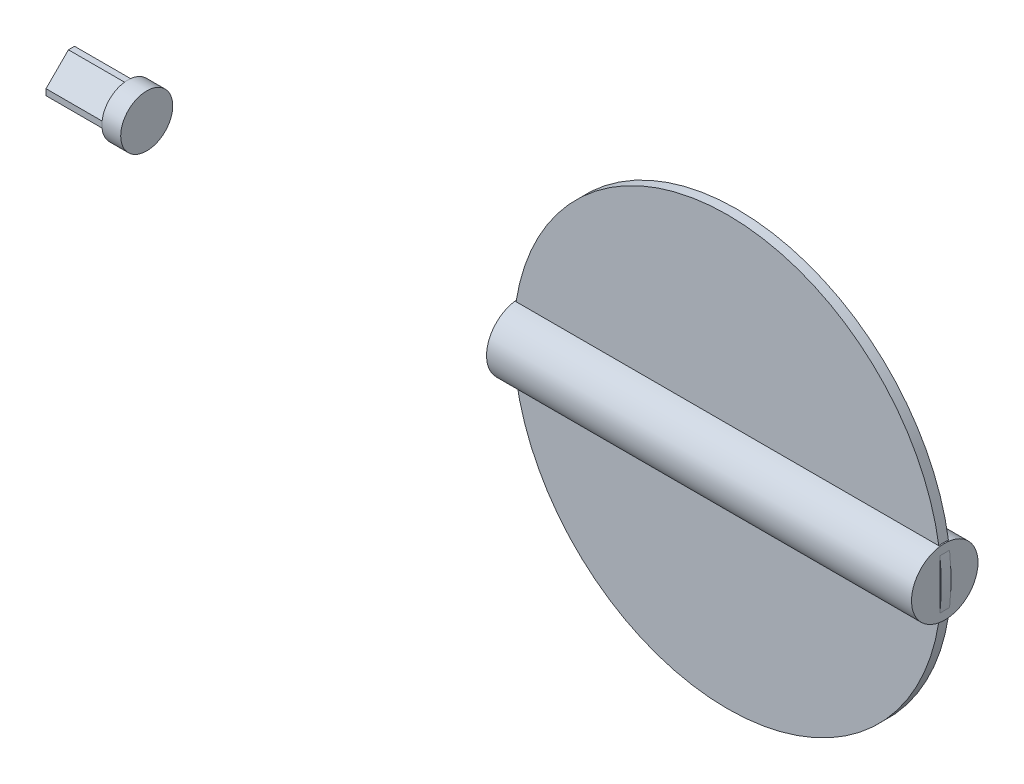
ISO-10303-21;
HEADER;
FILE_DESCRIPTION(('STEP AP214'),'2;1');
FILE_NAME('part.step','',(''),(''),'','','');
FILE_SCHEMA(('AUTOMOTIVE_DESIGN { 1 0 10303 214 1 1 1 1 }'));
ENDSEC;
DATA;
#1=APPLICATION_CONTEXT('core data for automotive mechanical design processes');
#2=APPLICATION_PROTOCOL_DEFINITION('international standard','automotive_design',2000,#1);
#3=PRODUCT_CONTEXT('',#1,'mechanical');
#4=PRODUCT('Part','Part','',(#3));
#5=PRODUCT_RELATED_PRODUCT_CATEGORY('part','',(#4));
#6=PRODUCT_DEFINITION_FORMATION('','',#4);
#7=PRODUCT_DEFINITION_CONTEXT('part definition',#1,'design');
#8=PRODUCT_DEFINITION('design','',#6,#7);
#9=PRODUCT_DEFINITION_SHAPE('','',#8);
#10=(LENGTH_UNIT() NAMED_UNIT(*) SI_UNIT(.MILLI.,.METRE.));
#11=(NAMED_UNIT(*) PLANE_ANGLE_UNIT() SI_UNIT($,.RADIAN.));
#12=(NAMED_UNIT(*) SI_UNIT($,.STERADIAN.) SOLID_ANGLE_UNIT());
#13=UNCERTAINTY_MEASURE_WITH_UNIT(LENGTH_MEASURE(1.E-05),#10,'distance_accuracy_value','');
#14=(GEOMETRIC_REPRESENTATION_CONTEXT(3) GLOBAL_UNCERTAINTY_ASSIGNED_CONTEXT((#13)) GLOBAL_UNIT_ASSIGNED_CONTEXT((#10,
#11,#12)) REPRESENTATION_CONTEXT('',''));
#15=CARTESIAN_POINT('',(0.,0.,0.));
#16=DIRECTION('',(0.,0.,1.));
#17=DIRECTION('',(1.,0.,0.));
#18=AXIS2_PLACEMENT_3D('',#15,#16,#17);
#19=CARTESIAN_POINT('',(-202.5519,0.,0.));
#20=DIRECTION('',(-1.,0.,0.));
#21=DIRECTION('',(0.,0.,1.));
#22=AXIS2_PLACEMENT_3D('',#19,#20,#21);
#23=CYLINDRICAL_SURFACE('',#22,9.);
#24=CARTESIAN_POINT('',(-202.5519,0.,0.));
#25=DIRECTION('',(1.,0.,0.));
#26=DIRECTION('',(0.,0.,-1.));
#27=AXIS2_PLACEMENT_3D('',#24,#25,#26);
#28=CIRCLE('',#27,9.);
#29=CARTESIAN_POINT('',(-202.5519,0.,9.));
#30=VERTEX_POINT('',#29);
#31=EDGE_CURVE('E12',#30,#30,#28,.T.);
#32=CARTESIAN_POINT('',(-209.0719,0.,0.));
#33=DIRECTION('',(1.,0.,0.));
#34=DIRECTION('',(0.,0.,-1.));
#35=AXIS2_PLACEMENT_3D('',#32,#33,#34);
#36=CIRCLE('',#35,9.);
#37=CARTESIAN_POINT('',(-209.0719,0.,9.));
#38=VERTEX_POINT('',#37);
#39=EDGE_CURVE('E53',#38,#38,#36,.T.);
#40=CARTESIAN_POINT('',(-202.5519,0.,9.));
#41=CARTESIAN_POINT('',(-202.619816666667,0.,9.));
#42=CARTESIAN_POINT('',(-202.687733333333,0.,9.));
#43=CARTESIAN_POINT('',(-202.823566666667,0.,9.));
#44=CARTESIAN_POINT('',(-202.891483333333,0.,9.));
#45=CARTESIAN_POINT('',(-203.027316666667,0.,9.));
#46=CARTESIAN_POINT('',(-203.095233333333,0.,9.));
#47=CARTESIAN_POINT('',(-203.231066666667,0.,9.));
#48=CARTESIAN_POINT('',(-203.298983333333,0.,9.));
#49=CARTESIAN_POINT('',(-203.434816666667,0.,9.));
#50=CARTESIAN_POINT('',(-203.502733333333,0.,9.));
#51=CARTESIAN_POINT('',(-203.638566666667,0.,9.));
#52=CARTESIAN_POINT('',(-203.706483333333,0.,9.));
#53=CARTESIAN_POINT('',(-203.842316666667,0.,9.));
#54=CARTESIAN_POINT('',(-203.910233333333,0.,9.));
#55=CARTESIAN_POINT('',(-204.046066666667,0.,9.));
#56=CARTESIAN_POINT('',(-204.113983333333,0.,9.));
#57=CARTESIAN_POINT('',(-204.249816666667,0.,9.));
#58=CARTESIAN_POINT('',(-204.317733333333,0.,9.));
#59=CARTESIAN_POINT('',(-204.453566666667,0.,9.));
#60=CARTESIAN_POINT('',(-204.521483333333,0.,9.));
#61=CARTESIAN_POINT('',(-204.657316666667,0.,9.));
#62=CARTESIAN_POINT('',(-204.725233333333,0.,9.));
#63=CARTESIAN_POINT('',(-204.861066666667,0.,9.));
#64=CARTESIAN_POINT('',(-204.928983333333,0.,9.));
#65=CARTESIAN_POINT('',(-205.064816666667,0.,9.));
#66=CARTESIAN_POINT('',(-205.132733333333,0.,9.));
#67=CARTESIAN_POINT('',(-205.268566666667,0.,9.));
#68=CARTESIAN_POINT('',(-205.336483333333,0.,9.));
#69=CARTESIAN_POINT('',(-205.472316666667,0.,9.));
#70=CARTESIAN_POINT('',(-205.540233333333,0.,9.));
#71=CARTESIAN_POINT('',(-205.676066666667,0.,9.));
#72=CARTESIAN_POINT('',(-205.743983333333,0.,9.));
#73=CARTESIAN_POINT('',(-205.879816666667,0.,9.));
#74=CARTESIAN_POINT('',(-205.947733333333,0.,9.));
#75=CARTESIAN_POINT('',(-206.083566666667,0.,9.));
#76=CARTESIAN_POINT('',(-206.151483333333,0.,9.));
#77=CARTESIAN_POINT('',(-206.287316666667,0.,9.));
#78=CARTESIAN_POINT('',(-206.355233333333,0.,9.));
#79=CARTESIAN_POINT('',(-206.491066666667,0.,9.));
#80=CARTESIAN_POINT('',(-206.558983333333,0.,9.));
#81=CARTESIAN_POINT('',(-206.694816666667,0.,9.));
#82=CARTESIAN_POINT('',(-206.762733333333,0.,9.));
#83=CARTESIAN_POINT('',(-206.898566666667,0.,9.));
#84=CARTESIAN_POINT('',(-206.966483333333,0.,9.));
#85=CARTESIAN_POINT('',(-207.102316666667,0.,9.));
#86=CARTESIAN_POINT('',(-207.170233333333,0.,9.));
#87=CARTESIAN_POINT('',(-207.306066666667,0.,9.));
#88=CARTESIAN_POINT('',(-207.373983333333,0.,9.));
#89=CARTESIAN_POINT('',(-207.509816666667,0.,9.));
#90=CARTESIAN_POINT('',(-207.577733333333,0.,9.));
#91=CARTESIAN_POINT('',(-207.713566666667,0.,9.));
#92=CARTESIAN_POINT('',(-207.781483333333,0.,9.));
#93=CARTESIAN_POINT('',(-207.917316666667,0.,9.));
#94=CARTESIAN_POINT('',(-207.985233333333,0.,9.));
#95=CARTESIAN_POINT('',(-208.121066666667,0.,9.));
#96=CARTESIAN_POINT('',(-208.188983333333,0.,9.));
#97=CARTESIAN_POINT('',(-208.324816666667,0.,9.));
#98=CARTESIAN_POINT('',(-208.392733333333,0.,9.));
#99=CARTESIAN_POINT('',(-208.528566666667,0.,9.));
#100=CARTESIAN_POINT('',(-208.596483333333,0.,9.));
#101=CARTESIAN_POINT('',(-208.732316666667,0.,9.));
#102=CARTESIAN_POINT('',(-208.800233333333,0.,9.));
#103=CARTESIAN_POINT('',(-208.936066666667,0.,9.));
#104=CARTESIAN_POINT('',(-209.003983333333,0.,9.));
#105=CARTESIAN_POINT('',(-209.0719,0.,9.));
#106=B_SPLINE_CURVE_WITH_KNOTS('',3,(#40,#41,#42,#43,#44,#45,#46,#47,#48,#49,#50,#51,#52,#53,
#54,#55,#56,#57,#58,#59,#60,#61,#62,#63,#64,#65,#66,#67,#68,#69,#70,#71,#72,#73,#74,#75,#76,#77,
#78,#79,#80,#81,#82,#83,#84,#85,#86,#87,#88,#89,#90,#91,#92,#93,#94,#95,#96,#97,#98,#99,#100,
#101,#102,#103,#104,#105),.UNSPECIFIED.,.F.,.F.,(4,2,2,2,2,2,2,2,2,2,2,2,2,2,2,2,2,2,2,2,2,2,2,
2,2,2,2,2,2,2,2,2,4),(0.,0.203750000000003,0.407500000000005,0.611250000000008,0.81500000000001,
1.01875000000001,1.22250000000002,1.42625000000002,1.63000000000002,1.83375000000002,
2.03750000000003,2.24125,2.445,2.64875000000001,2.85250000000001,3.05625000000001,
3.26000000000001,3.46375000000002,3.66750000000002,3.87125000000002,4.07500000000002,4.27875,
4.4825,4.68625,4.89000000000001,5.09375000000001,5.29750000000001,5.50125000000001,
5.70500000000002,5.90875000000002,6.11250000000002,6.31625000000002,6.52),.UNSPECIFIED.);
#107=EDGE_CURVE('BSEAM51',#30,#38,#106,.T.);
#108=ORIENTED_EDGE('',*,*,#31,.F.);
#109=ORIENTED_EDGE('',*,*,#39,.T.);
#110=ORIENTED_EDGE('',*,*,#107,.T.);
#111=ORIENTED_EDGE('',*,*,#107,.F.);
#112=EDGE_LOOP('',(#108,#110,#109,#111));
#113=FACE_BOUND('',#112,.T.);
#114=ADVANCED_FACE('F51',(#113),#23,.T.);
#115=CARTESIAN_POINT('',(-202.5519,0.,0.));
#116=DIRECTION('',(1.,0.,0.));
#117=DIRECTION('',(0.,0.,-1.));
#118=AXIS2_PLACEMENT_3D('',#115,#116,#117);
#119=PLANE('',#118);
#120=ORIENTED_EDGE('',*,*,#31,.T.);
#121=EDGE_LOOP('',(#120));
#122=FACE_BOUND('',#121,.T.);
#123=ADVANCED_FACE('F194',(#122),#119,.T.);
#124=CARTESIAN_POINT('',(-209.0719,0.,0.));
#125=DIRECTION('',(1.,0.,0.));
#126=DIRECTION('',(0.,0.,-1.));
#127=AXIS2_PLACEMENT_3D('',#124,#125,#126);
#128=PLANE('',#127);
#129=DIRECTION('',(0.,0.,1.));
#130=VECTOR('',#129,1.);
#131=CARTESIAN_POINT('',(-209.0719,8.82,-1.06));
#132=LINE('',#131,#130);
#133=CARTESIAN_POINT('',(-209.0719,8.82,-1.06));
#134=VERTEX_POINT('',#133);
#135=CARTESIAN_POINT('',(-209.0719,8.82,1.06));
#136=VERTEX_POINT('',#135);
#137=EDGE_CURVE('E157',#134,#136,#132,.T.);
#138=ORIENTED_EDGE('',*,*,#137,.T.);
#139=DIRECTION('',(0.,-0.707106781186547,0.707106781186547));
#140=VECTOR('',#139,1.);
#141=CARTESIAN_POINT('',(-209.0719,8.82,1.06));
#142=LINE('',#141,#140);
#143=CARTESIAN_POINT('',(-209.0719,1.06,8.82));
#144=VERTEX_POINT('',#143);
#145=EDGE_CURVE('E62',#136,#144,#142,.T.);
#146=ORIENTED_EDGE('',*,*,#145,.T.);
#147=DIRECTION('',(0.,-1.,0.));
#148=VECTOR('',#147,1.);
#149=CARTESIAN_POINT('',(-209.0719,1.06,8.82));
#150=LINE('',#149,#148);
#151=CARTESIAN_POINT('',(-209.0719,-1.06,8.82));
#152=VERTEX_POINT('',#151);
#153=EDGE_CURVE('E114',#144,#152,#150,.T.);
#154=ORIENTED_EDGE('',*,*,#153,.T.);
#155=DIRECTION('',(0.,-0.707106781186547,-0.707106781186547));
#156=VECTOR('',#155,1.);
#157=CARTESIAN_POINT('',(-209.0719,-1.06,8.82));
#158=LINE('',#157,#156);
#159=CARTESIAN_POINT('',(-209.0719,-8.82,1.06));
#160=VERTEX_POINT('',#159);
#161=EDGE_CURVE('E152',#152,#160,#158,.T.);
#162=ORIENTED_EDGE('',*,*,#161,.T.);
#163=DIRECTION('',(0.,0.,-1.));
#164=VECTOR('',#163,1.);
#165=CARTESIAN_POINT('',(-209.0719,-8.82,1.06));
#166=LINE('',#165,#164);
#167=CARTESIAN_POINT('',(-209.0719,-8.82,-1.06));
#168=VERTEX_POINT('',#167);
#169=EDGE_CURVE('E155',#160,#168,#166,.T.);
#170=ORIENTED_EDGE('',*,*,#169,.T.);
#171=DIRECTION('',(0.,0.707106781186547,-0.707106781186547));
#172=VECTOR('',#171,1.);
#173=CARTESIAN_POINT('',(-209.0719,-8.82,-1.06));
#174=LINE('',#173,#172);
#175=CARTESIAN_POINT('',(-209.0719,-1.06,-8.82));
#176=VERTEX_POINT('',#175);
#177=EDGE_CURVE('E128',#168,#176,#174,.T.);
#178=ORIENTED_EDGE('',*,*,#177,.T.);
#179=DIRECTION('',(0.,1.,0.));
#180=VECTOR('',#179,1.);
#181=CARTESIAN_POINT('',(-209.0719,-1.06,-8.82));
#182=LINE('',#181,#180);
#183=CARTESIAN_POINT('',(-209.0719,1.06,-8.82));
#184=VERTEX_POINT('',#183);
#185=EDGE_CURVE('E140',#176,#184,#182,.T.);
#186=ORIENTED_EDGE('',*,*,#185,.T.);
#187=DIRECTION('',(0.,0.707106781186547,0.707106781186547));
#188=VECTOR('',#187,1.);
#189=CARTESIAN_POINT('',(-209.0719,1.06,-8.82));
#190=LINE('',#189,#188);
#191=EDGE_CURVE('E144',#184,#134,#190,.T.);
#192=ORIENTED_EDGE('',*,*,#191,.T.);
#193=EDGE_LOOP('',(#138,#146,#154,#162,#170,#178,#186,#192));
#194=FACE_BOUND('',#193,.T.);
#195=ORIENTED_EDGE('',*,*,#39,.F.);
#196=EDGE_LOOP('',(#195));
#197=FACE_BOUND('',#196,.T.);
#198=ADVANCED_FACE('F146',(#194,#197),#128,.F.);
#199=CARTESIAN_POINT('',(-209.0719,8.82,1.06));
#200=DIRECTION('',(0.,-0.707106781186548,-0.707106781186548));
#201=DIRECTION('',(0.,0.707106781186548,-0.707106781186548));
#202=AXIS2_PLACEMENT_3D('',#199,#200,#201);
#203=PLANE('',#202);
#204=DIRECTION('',(0.,-0.707106781186547,0.707106781186547));
#205=VECTOR('',#204,1.);
#206=CARTESIAN_POINT('',(-228.5719,8.82,1.06));
#207=LINE('',#206,#205);
#208=CARTESIAN_POINT('',(-228.5719,8.82,1.06));
#209=VERTEX_POINT('',#208);
#210=CARTESIAN_POINT('',(-228.5719,1.06,8.82));
#211=VERTEX_POINT('',#210);
#212=EDGE_CURVE('E165',#209,#211,#207,.T.);
#213=ORIENTED_EDGE('',*,*,#212,.T.);
#214=DIRECTION('',(-1.,0.,0.));
#215=VECTOR('',#214,1.);
#216=CARTESIAN_POINT('',(-209.0719,1.06,8.82));
#217=LINE('',#216,#215);
#218=EDGE_CURVE('E186',#144,#211,#217,.T.);
#219=ORIENTED_EDGE('',*,*,#218,.F.);
#220=ORIENTED_EDGE('',*,*,#145,.F.);
#221=DIRECTION('',(-1.,0.,0.));
#222=VECTOR('',#221,1.);
#223=CARTESIAN_POINT('',(-209.0719,8.82,1.06));
#224=LINE('',#223,#222);
#225=EDGE_CURVE('E161',#136,#209,#224,.T.);
#226=ORIENTED_EDGE('',*,*,#225,.T.);
#227=EDGE_LOOP('',(#213,#219,#220,#226));
#228=FACE_BOUND('',#227,.T.);
#229=ADVANCED_FACE('F192',(#228),#203,.F.);
#230=CARTESIAN_POINT('',(-209.0719,1.06,8.82));
#231=DIRECTION('',(0.,0.,-1.));
#232=DIRECTION('',(-1.,0.,0.));
#233=AXIS2_PLACEMENT_3D('',#230,#231,#232);
#234=PLANE('',#233);
#235=DIRECTION('',(0.,-1.,0.));
#236=VECTOR('',#235,1.);
#237=CARTESIAN_POINT('',(-228.5719,1.06,8.82));
#238=LINE('',#237,#236);
#239=CARTESIAN_POINT('',(-228.5719,-1.06,8.82));
#240=VERTEX_POINT('',#239);
#241=EDGE_CURVE('E164',#211,#240,#238,.T.);
#242=ORIENTED_EDGE('',*,*,#241,.T.);
#243=DIRECTION('',(-1.,0.,0.));
#244=VECTOR('',#243,1.);
#245=CARTESIAN_POINT('',(-209.0719,-1.06,8.82));
#246=LINE('',#245,#244);
#247=EDGE_CURVE('E184',#152,#240,#246,.T.);
#248=ORIENTED_EDGE('',*,*,#247,.F.);
#249=ORIENTED_EDGE('',*,*,#153,.F.);
#250=ORIENTED_EDGE('',*,*,#218,.T.);
#251=EDGE_LOOP('',(#242,#248,#249,#250));
#252=FACE_BOUND('',#251,.T.);
#253=ADVANCED_FACE('F196',(#252),#234,.F.);
#254=CARTESIAN_POINT('',(-209.0719,-1.06,8.82));
#255=DIRECTION('',(0.,0.707106781186548,-0.707106781186548));
#256=DIRECTION('',(0.,0.707106781186548,0.707106781186548));
#257=AXIS2_PLACEMENT_3D('',#254,#255,#256);
#258=PLANE('',#257);
#259=DIRECTION('',(0.,-0.707106781186547,-0.707106781186547));
#260=VECTOR('',#259,1.);
#261=CARTESIAN_POINT('',(-228.5719,-1.06,8.82));
#262=LINE('',#261,#260);
#263=CARTESIAN_POINT('',(-228.5719,-8.82,1.06));
#264=VERTEX_POINT('',#263);
#265=EDGE_CURVE('E170',#240,#264,#262,.T.);
#266=ORIENTED_EDGE('',*,*,#265,.T.);
#267=DIRECTION('',(-1.,0.,0.));
#268=VECTOR('',#267,1.);
#269=CARTESIAN_POINT('',(-209.0719,-8.82,1.06));
#270=LINE('',#269,#268);
#271=EDGE_CURVE('E182',#160,#264,#270,.T.);
#272=ORIENTED_EDGE('',*,*,#271,.F.);
#273=ORIENTED_EDGE('',*,*,#161,.F.);
#274=ORIENTED_EDGE('',*,*,#247,.T.);
#275=EDGE_LOOP('',(#266,#272,#273,#274));
#276=FACE_BOUND('',#275,.T.);
#277=ADVANCED_FACE('F232',(#276),#258,.F.);
#278=CARTESIAN_POINT('',(-209.0719,-8.82,1.06));
#279=DIRECTION('',(0.,1.,0.));
#280=DIRECTION('',(0.,0.,1.));
#281=AXIS2_PLACEMENT_3D('',#278,#279,#280);
#282=PLANE('',#281);
#283=DIRECTION('',(0.,0.,-1.));
#284=VECTOR('',#283,1.);
#285=CARTESIAN_POINT('',(-228.5719,-8.82,1.06));
#286=LINE('',#285,#284);
#287=CARTESIAN_POINT('',(-228.5719,-8.82,-1.06));
#288=VERTEX_POINT('',#287);
#289=EDGE_CURVE('E166',#264,#288,#286,.T.);
#290=ORIENTED_EDGE('',*,*,#289,.T.);
#291=DIRECTION('',(-1.,0.,0.));
#292=VECTOR('',#291,1.);
#293=CARTESIAN_POINT('',(-209.0719,-8.82,-1.06));
#294=LINE('',#293,#292);
#295=EDGE_CURVE('E136',#168,#288,#294,.T.);
#296=ORIENTED_EDGE('',*,*,#295,.F.);
#297=ORIENTED_EDGE('',*,*,#169,.F.);
#298=ORIENTED_EDGE('',*,*,#271,.T.);
#299=EDGE_LOOP('',(#290,#296,#297,#298));
#300=FACE_BOUND('',#299,.T.);
#301=ADVANCED_FACE('F244',(#300),#282,.F.);
#302=CARTESIAN_POINT('',(-209.0719,-8.82,-1.06));
#303=DIRECTION('',(0.,0.707106781186548,0.707106781186548));
#304=DIRECTION('',(0.,-0.707106781186548,0.707106781186548));
#305=AXIS2_PLACEMENT_3D('',#302,#303,#304);
#306=PLANE('',#305);
#307=DIRECTION('',(0.,0.707106781186547,-0.707106781186547));
#308=VECTOR('',#307,1.);
#309=CARTESIAN_POINT('',(-228.5719,-8.82,-1.06));
#310=LINE('',#309,#308);
#311=CARTESIAN_POINT('',(-228.5719,-1.06,-8.82));
#312=VERTEX_POINT('',#311);
#313=EDGE_CURVE('E135',#288,#312,#310,.T.);
#314=ORIENTED_EDGE('',*,*,#313,.T.);
#315=DIRECTION('',(-1.,0.,0.));
#316=VECTOR('',#315,1.);
#317=CARTESIAN_POINT('',(-209.0719,-1.06,-8.82));
#318=LINE('',#317,#316);
#319=EDGE_CURVE('E125',#176,#312,#318,.T.);
#320=ORIENTED_EDGE('',*,*,#319,.F.);
#321=ORIENTED_EDGE('',*,*,#177,.F.);
#322=ORIENTED_EDGE('',*,*,#295,.T.);
#323=EDGE_LOOP('',(#314,#320,#321,#322));
#324=FACE_BOUND('',#323,.T.);
#325=ADVANCED_FACE('F130',(#324),#306,.F.);
#326=CARTESIAN_POINT('',(-209.0719,-1.06,-8.82));
#327=DIRECTION('',(0.,0.,1.));
#328=DIRECTION('',(1.,0.,0.));
#329=AXIS2_PLACEMENT_3D('',#326,#327,#328);
#330=PLANE('',#329);
#331=DIRECTION('',(0.,1.,0.));
#332=VECTOR('',#331,1.);
#333=CARTESIAN_POINT('',(-228.5719,-1.06,-8.82));
#334=LINE('',#333,#332);
#335=CARTESIAN_POINT('',(-228.5719,1.06,-8.82));
#336=VERTEX_POINT('',#335);
#337=EDGE_CURVE('E171',#312,#336,#334,.T.);
#338=ORIENTED_EDGE('',*,*,#337,.T.);
#339=DIRECTION('',(-1.,0.,0.));
#340=VECTOR('',#339,1.);
#341=CARTESIAN_POINT('',(-209.0719,1.06,-8.82));
#342=LINE('',#341,#340);
#343=EDGE_CURVE('E137',#184,#336,#342,.T.);
#344=ORIENTED_EDGE('',*,*,#343,.F.);
#345=ORIENTED_EDGE('',*,*,#185,.F.);
#346=ORIENTED_EDGE('',*,*,#319,.T.);
#347=EDGE_LOOP('',(#338,#344,#345,#346));
#348=FACE_BOUND('',#347,.T.);
#349=ADVANCED_FACE('F143',(#348),#330,.F.);
#350=CARTESIAN_POINT('',(-209.0719,1.06,-8.82));
#351=DIRECTION('',(0.,-0.707106781186548,0.707106781186548));
#352=DIRECTION('',(0.,-0.707106781186548,-0.707106781186548));
#353=AXIS2_PLACEMENT_3D('',#350,#351,#352);
#354=PLANE('',#353);
#355=DIRECTION('',(0.,0.707106781186547,0.707106781186547));
#356=VECTOR('',#355,1.);
#357=CARTESIAN_POINT('',(-228.5719,1.06,-8.82));
#358=LINE('',#357,#356);
#359=CARTESIAN_POINT('',(-228.5719,8.82,-1.06));
#360=VERTEX_POINT('',#359);
#361=EDGE_CURVE('E173',#336,#360,#358,.T.);
#362=ORIENTED_EDGE('',*,*,#361,.T.);
#363=DIRECTION('',(-1.,0.,0.));
#364=VECTOR('',#363,1.);
#365=CARTESIAN_POINT('',(-209.0719,8.82,-1.06));
#366=LINE('',#365,#364);
#367=EDGE_CURVE('E74',#134,#360,#366,.T.);
#368=ORIENTED_EDGE('',*,*,#367,.F.);
#369=ORIENTED_EDGE('',*,*,#191,.F.);
#370=ORIENTED_EDGE('',*,*,#343,.T.);
#371=EDGE_LOOP('',(#362,#368,#369,#370));
#372=FACE_BOUND('',#371,.T.);
#373=ADVANCED_FACE('F268',(#372),#354,.F.);
#374=CARTESIAN_POINT('',(-209.0719,8.82,-1.06));
#375=DIRECTION('',(0.,-1.,0.));
#376=DIRECTION('',(0.,0.,-1.));
#377=AXIS2_PLACEMENT_3D('',#374,#375,#376);
#378=PLANE('',#377);
#379=DIRECTION('',(0.,0.,1.));
#380=VECTOR('',#379,1.);
#381=CARTESIAN_POINT('',(-228.5719,8.82,-1.06));
#382=LINE('',#381,#380);
#383=EDGE_CURVE('E104',#360,#209,#382,.T.);
#384=ORIENTED_EDGE('',*,*,#383,.T.);
#385=ORIENTED_EDGE('',*,*,#225,.F.);
#386=ORIENTED_EDGE('',*,*,#137,.F.);
#387=ORIENTED_EDGE('',*,*,#367,.T.);
#388=EDGE_LOOP('',(#384,#385,#386,#387));
#389=FACE_BOUND('',#388,.T.);
#390=ADVANCED_FACE('F280',(#389),#378,.F.);
#391=CARTESIAN_POINT('',(-228.5719,0.,0.));
#392=DIRECTION('',(1.,0.,0.));
#393=DIRECTION('',(0.,0.,-1.));
#394=AXIS2_PLACEMENT_3D('',#391,#392,#393);
#395=PLANE('',#394);
#396=ORIENTED_EDGE('',*,*,#212,.F.);
#397=ORIENTED_EDGE('',*,*,#383,.F.);
#398=ORIENTED_EDGE('',*,*,#361,.F.);
#399=ORIENTED_EDGE('',*,*,#337,.F.);
#400=ORIENTED_EDGE('',*,*,#313,.F.);
#401=ORIENTED_EDGE('',*,*,#289,.F.);
#402=ORIENTED_EDGE('',*,*,#265,.F.);
#403=ORIENTED_EDGE('',*,*,#241,.F.);
#404=EDGE_LOOP('',(#396,#397,#398,#399,#400,#401,#402,#403));
#405=FACE_BOUND('',#404,.T.);
#406=ADVANCED_FACE('F286',(#405),#395,.F.);
#407=CLOSED_SHELL('',(#114,#123,#198,#229,#253,#277,#301,#325,#349,#373,#390,#406));
#408=MANIFOLD_SOLID_BREP('B2',#407);
#409=CARTESIAN_POINT('',(0.,0.,1.665));
#410=DIRECTION('',(0.,0.,-1.));
#411=DIRECTION('',(-1.,0.,0.));
#412=AXIS2_PLACEMENT_3D('',#409,#410,#411);
#413=CYLINDRICAL_SURFACE('',#412,74.);
#414=CARTESIAN_POINT('',(73.1199167463968,-11.3788301244021,1.665));
#415=CARTESIAN_POINT('',(73.1136149441319,-11.419270395525,1.38876118608167));
#416=CARTESIAN_POINT('',(73.1088665566271,-11.4496173672546,1.11101159802652));
#417=CARTESIAN_POINT('',(73.1025463457405,-11.489927829049,0.555502622316472));
#418=CARTESIAN_POINT('',(73.100957586069,-11.5,0.277751311158236));
#419=CARTESIAN_POINT('',(73.100957586069,-11.5,-0.277751311158235));
#420=CARTESIAN_POINT('',(73.1025463457405,-11.489927829049,-0.555502622316471));
#421=CARTESIAN_POINT('',(73.1088665566271,-11.4496173672546,-1.11101159802652));
#422=CARTESIAN_POINT('',(73.1136149441319,-11.419270395525,-1.38876118608167));
#423=CARTESIAN_POINT('',(73.1199167463968,-11.3788301244021,-1.665));
#424=B_SPLINE_CURVE_WITH_KNOTS('',3,(#414,#415,#416,#417,#418,#419,#420,#421,#422,#423),
.UNSPECIFIED.,.F.,.F.,(4,2,2,2,4),(0.,0.837570548250217,1.67063930449516,2.5037080607401,
3.34127860899032),.UNSPECIFIED.);
#425=CARTESIAN_POINT('',(73.1199167463968,-11.3788301244021,1.665));
#426=VERTEX_POINT('',#425);
#427=CARTESIAN_POINT('',(73.1199167463968,-11.3788301244021,-1.665));
#428=VERTEX_POINT('',#427);
#429=EDGE_CURVE('E324',#426,#428,#424,.T.);
#430=ORIENTED_EDGE('',*,*,#429,.F.);
#431=CARTESIAN_POINT('',(0.,0.,1.665));
#432=DIRECTION('',(0.,0.,1.));
#433=DIRECTION('',(1.,0.,0.));
#434=AXIS2_PLACEMENT_3D('',#431,#432,#433);
#435=CIRCLE('',#434,74.);
#436=CARTESIAN_POINT('',(-73.1199167463968,-11.3788301244021,1.665));
#437=VERTEX_POINT('',#436);
#438=EDGE_CURVE('E427',#437,#426,#435,.T.);
#439=ORIENTED_EDGE('',*,*,#438,.F.);
#440=CARTESIAN_POINT('',(-73.1199167463968,-11.3788301244021,-1.665));
#441=CARTESIAN_POINT('',(-73.1136149441319,-11.419270395525,-1.38876118608167));
#442=CARTESIAN_POINT('',(-73.1088665566271,-11.4496173672546,-1.11101159802652));
#443=CARTESIAN_POINT('',(-73.1025463457405,-11.489927829049,-0.555502622316472));
#444=CARTESIAN_POINT('',(-73.100957586069,-11.5,-0.277751311158236));
#445=CARTESIAN_POINT('',(-73.100957586069,-11.5,0.277751311158235));
#446=CARTESIAN_POINT('',(-73.1025463457405,-11.489927829049,0.555502622316471));
#447=CARTESIAN_POINT('',(-73.1088665566271,-11.4496173672546,1.11101159802652));
#448=CARTESIAN_POINT('',(-73.1136149441319,-11.419270395525,1.38876118608167));
#449=CARTESIAN_POINT('',(-73.1199167463968,-11.3788301244021,1.665));
#450=B_SPLINE_CURVE_WITH_KNOTS('',3,(#440,#441,#442,#443,#444,#445,#446,#447,#448,#449),
.UNSPECIFIED.,.F.,.F.,(4,2,2,2,4),(0.,0.837570548250217,1.67063930449516,2.5037080607401,
3.34127860899032),.UNSPECIFIED.);
#451=CARTESIAN_POINT('',(-73.1199167463968,-11.3788301244021,-1.665));
#452=VERTEX_POINT('',#451);
#453=EDGE_CURVE('E414',#452,#437,#450,.T.);
#454=ORIENTED_EDGE('',*,*,#453,.F.);
#455=CARTESIAN_POINT('',(0.,0.,-1.665));
#456=DIRECTION('',(0.,0.,1.));
#457=DIRECTION('',(1.,0.,0.));
#458=AXIS2_PLACEMENT_3D('',#455,#456,#457);
#459=CIRCLE('',#458,74.);
#460=EDGE_CURVE('E382',#452,#428,#459,.T.);
#461=ORIENTED_EDGE('',*,*,#460,.T.);
#462=EDGE_LOOP('',(#430,#439,#454,#461));
#463=FACE_BOUND('',#462,.T.);
#464=ADVANCED_FACE('F310',(#463),#413,.T.);
#465=CARTESIAN_POINT('',(0.,0.,1.665));
#466=DIRECTION('',(0.,0.,1.));
#467=DIRECTION('',(1.,0.,0.));
#468=AXIS2_PLACEMENT_3D('',#465,#466,#467);
#469=PLANE('',#468);
#470=ORIENTED_EDGE('',*,*,#438,.T.);
#471=DIRECTION('',(-1.,0.,0.));
#472=VECTOR('',#471,1.);
#473=CARTESIAN_POINT('',(73.5,-11.3788301244021,1.665));
#474=LINE('',#473,#472);
#475=EDGE_CURVE('E332',#426,#437,#474,.T.);
#476=ORIENTED_EDGE('',*,*,#475,.T.);
#477=EDGE_LOOP('',(#470,#476));
#478=FACE_BOUND('',#477,.T.);
#479=ADVANCED_FACE('F478',(#478),#469,.T.);
#480=CARTESIAN_POINT('',(0.,0.,-1.665));
#481=DIRECTION('',(0.,0.,1.));
#482=DIRECTION('',(1.,0.,0.));
#483=AXIS2_PLACEMENT_3D('',#480,#481,#482);
#484=PLANE('',#483);
#485=DIRECTION('',(-1.,0.,0.));
#486=VECTOR('',#485,1.);
#487=CARTESIAN_POINT('',(73.5,-11.3788301244021,-1.665));
#488=LINE('',#487,#486);
#489=EDGE_CURVE('E318',#428,#452,#488,.T.);
#490=ORIENTED_EDGE('',*,*,#489,.F.);
#491=ORIENTED_EDGE('',*,*,#460,.F.);
#492=EDGE_LOOP('',(#490,#491));
#493=FACE_BOUND('',#492,.T.);
#494=ADVANCED_FACE('F415',(#493),#484,.F.);
#495=CARTESIAN_POINT('',(73.5,0.,0.));
#496=DIRECTION('',(-1.,0.,0.));
#497=DIRECTION('',(0.,0.,1.));
#498=AXIS2_PLACEMENT_3D('',#495,#496,#497);
#499=CYLINDRICAL_SURFACE('',#498,11.5);
#500=DIRECTION('',(-1.,0.,0.));
#501=VECTOR('',#500,1.);
#502=CARTESIAN_POINT('',(73.5,11.3788301244021,1.665));
#503=LINE('',#502,#501);
#504=CARTESIAN_POINT('',(-73.1199167463968,11.3788301244021,1.665));
#505=VERTEX_POINT('',#504);
#506=CARTESIAN_POINT('',(73.1199167463968,11.3788301244021,1.665));
#507=VERTEX_POINT('',#506);
#508=EDGE_CURVE('E417',#505,#507,#503,.F.);
#509=ORIENTED_EDGE('',*,*,#508,.F.);
#510=CARTESIAN_POINT('',(-73.1199167463968,11.3788301244021,1.665));
#511=CARTESIAN_POINT('',(-73.1136149441319,11.419270395525,1.38876118608167));
#512=CARTESIAN_POINT('',(-73.1088665566271,11.4496173672546,1.11101159802652));
#513=CARTESIAN_POINT('',(-73.1025463457405,11.489927829049,0.555502622316472));
#514=CARTESIAN_POINT('',(-73.100957586069,11.5,0.277751311158236));
#515=CARTESIAN_POINT('',(-73.100957586069,11.5,-0.277751311158235));
#516=CARTESIAN_POINT('',(-73.1025463457405,11.489927829049,-0.555502622316471));
#517=CARTESIAN_POINT('',(-73.1088665566271,11.4496173672546,-1.11101159802652));
#518=CARTESIAN_POINT('',(-73.1136149441319,11.419270395525,-1.38876118608167));
#519=CARTESIAN_POINT('',(-73.1199167463968,11.3788301244021,-1.665));
#520=B_SPLINE_CURVE_WITH_KNOTS('',3,(#510,#511,#512,#513,#514,#515,#516,#517,#518,#519),
.UNSPECIFIED.,.F.,.F.,(4,2,2,2,4),(0.,0.837570548250217,1.67063930449516,2.5037080607401,
3.34127860899032),.UNSPECIFIED.);
#521=CARTESIAN_POINT('',(-73.1199167463968,11.3788301244021,-1.665));
#522=VERTEX_POINT('',#521);
#523=EDGE_CURVE('E425',#505,#522,#520,.T.);
#524=ORIENTED_EDGE('',*,*,#523,.T.);
#525=DIRECTION('',(-1.,0.,0.));
#526=VECTOR('',#525,1.);
#527=CARTESIAN_POINT('',(73.5,11.3788301244021,-1.665));
#528=LINE('',#527,#526);
#529=CARTESIAN_POINT('',(73.1199167463968,11.3788301244021,-1.665));
#530=VERTEX_POINT('',#529);
#531=EDGE_CURVE('E47',#522,#530,#528,.F.);
#532=ORIENTED_EDGE('',*,*,#531,.T.);
#533=CARTESIAN_POINT('',(73.1199167463968,11.3788301244021,-1.665));
#534=CARTESIAN_POINT('',(73.1136149441319,11.419270395525,-1.38876118608167));
#535=CARTESIAN_POINT('',(73.1088665566271,11.4496173672546,-1.11101159802652));
#536=CARTESIAN_POINT('',(73.1025463457405,11.489927829049,-0.555502622316472));
#537=CARTESIAN_POINT('',(73.100957586069,11.5,-0.277751311158236));
#538=CARTESIAN_POINT('',(73.100957586069,11.5,0.277751311158235));
#539=CARTESIAN_POINT('',(73.1025463457405,11.489927829049,0.555502622316471));
#540=CARTESIAN_POINT('',(73.1088665566271,11.4496173672546,1.11101159802652));
#541=CARTESIAN_POINT('',(73.1136149441319,11.419270395525,1.38876118608167));
#542=CARTESIAN_POINT('',(73.1199167463968,11.3788301244021,1.665));
#543=B_SPLINE_CURVE_WITH_KNOTS('',3,(#533,#534,#535,#536,#537,#538,#539,#540,#541,#542),
.UNSPECIFIED.,.F.,.F.,(4,2,2,2,4),(0.,0.837570548250217,1.67063930449516,2.5037080607401,
3.34127860899032),.UNSPECIFIED.);
#544=EDGE_CURVE('E439',#530,#507,#543,.T.);
#545=ORIENTED_EDGE('',*,*,#544,.T.);
#546=EDGE_LOOP('',(#509,#524,#532,#545));
#547=FACE_BOUND('',#546,.T.);
#548=ORIENTED_EDGE('',*,*,#475,.F.);
#549=ORIENTED_EDGE('',*,*,#429,.T.);
#550=ORIENTED_EDGE('',*,*,#489,.T.);
#551=ORIENTED_EDGE('',*,*,#453,.T.);
#552=EDGE_LOOP('',(#548,#549,#550,#551));
#553=FACE_BOUND('',#552,.T.);
#554=CARTESIAN_POINT('',(73.5,0.,0.));
#555=DIRECTION('',(1.,0.,0.));
#556=DIRECTION('',(0.,0.,-1.));
#557=AXIS2_PLACEMENT_3D('',#554,#555,#556);
#558=CIRCLE('',#557,11.5);
#559=CARTESIAN_POINT('',(73.5,0.,-11.5));
#560=VERTEX_POINT('',#559);
#561=EDGE_CURVE('E393',#560,#560,#558,.T.);
#562=ORIENTED_EDGE('',*,*,#561,.F.);
#563=EDGE_LOOP('',(#562));
#564=FACE_BOUND('',#563,.T.);
#565=CARTESIAN_POINT('',(-73.5,0.,0.));
#566=DIRECTION('',(1.,0.,0.));
#567=DIRECTION('',(0.,0.,-1.));
#568=AXIS2_PLACEMENT_3D('',#565,#566,#567);
#569=CIRCLE('',#568,11.5);
#570=CARTESIAN_POINT('',(-73.5,0.,-11.5));
#571=VERTEX_POINT('',#570);
#572=EDGE_CURVE('E513',#571,#571,#569,.T.);
#573=ORIENTED_EDGE('',*,*,#572,.T.);
#574=EDGE_LOOP('',(#573));
#575=FACE_BOUND('',#574,.T.);
#576=ADVANCED_FACE('F407',(#547,#553,#564,#575),#499,.T.);
#577=CARTESIAN_POINT('',(73.5,0.,0.));
#578=DIRECTION('',(1.,0.,0.));
#579=DIRECTION('',(0.,0.,-1.));
#580=AXIS2_PLACEMENT_3D('',#577,#578,#579);
#581=PLANE('',#580);
#582=DIRECTION('',(0.,0.,-1.));
#583=VECTOR('',#582,1.);
#584=CARTESIAN_POINT('',(73.5,-8.58778201865884,1.665));
#585=LINE('',#584,#583);
#586=CARTESIAN_POINT('',(73.5,-8.58778201865884,1.665));
#587=VERTEX_POINT('',#586);
#588=CARTESIAN_POINT('',(73.5,-8.58778201865884,-1.665));
#589=VERTEX_POINT('',#588);
#590=EDGE_CURVE('E502',#587,#589,#585,.T.);
#591=ORIENTED_EDGE('',*,*,#590,.F.);
#592=DIRECTION('',(0.,1.,0.));
#593=VECTOR('',#592,1.);
#594=CARTESIAN_POINT('',(73.5,0.,1.665));
#595=LINE('',#594,#593);
#596=CARTESIAN_POINT('',(73.5,8.58778201865884,1.665));
#597=VERTEX_POINT('',#596);
#598=EDGE_CURVE('E508',#587,#597,#595,.T.);
#599=ORIENTED_EDGE('',*,*,#598,.T.);
#600=DIRECTION('',(0.,0.,-1.));
#601=VECTOR('',#600,1.);
#602=CARTESIAN_POINT('',(73.5,8.58778201865884,1.665));
#603=LINE('',#602,#601);
#604=CARTESIAN_POINT('',(73.5,8.58778201865884,-1.665));
#605=VERTEX_POINT('',#604);
#606=EDGE_CURVE('E505',#605,#597,#603,.F.);
#607=ORIENTED_EDGE('',*,*,#606,.F.);
#608=DIRECTION('',(0.,1.,0.));
#609=VECTOR('',#608,1.);
#610=CARTESIAN_POINT('',(73.5,0.,-1.665));
#611=LINE('',#610,#609);
#612=EDGE_CURVE('E399',#589,#605,#611,.T.);
#613=ORIENTED_EDGE('',*,*,#612,.F.);
#614=EDGE_LOOP('',(#591,#599,#607,#613));
#615=FACE_BOUND('',#614,.T.);
#616=ORIENTED_EDGE('',*,*,#561,.T.);
#617=EDGE_LOOP('',(#616));
#618=FACE_BOUND('',#617,.T.);
#619=ADVANCED_FACE('F447',(#615,#618),#581,.T.);
#620=CARTESIAN_POINT('',(-73.5,0.,0.));
#621=DIRECTION('',(1.,0.,0.));
#622=DIRECTION('',(0.,0.,-1.));
#623=AXIS2_PLACEMENT_3D('',#620,#621,#622);
#624=PLANE('',#623);
#625=DIRECTION('',(0.,1.,0.));
#626=VECTOR('',#625,1.);
#627=CARTESIAN_POINT('',(-73.5,0.,1.665));
#628=LINE('',#627,#626);
#629=CARTESIAN_POINT('',(-73.5,-8.58778201865884,1.665));
#630=VERTEX_POINT('',#629);
#631=CARTESIAN_POINT('',(-73.5,8.58778201865884,1.665));
#632=VERTEX_POINT('',#631);
#633=EDGE_CURVE('E501',#630,#632,#628,.T.);
#634=ORIENTED_EDGE('',*,*,#633,.F.);
#635=DIRECTION('',(0.,0.,-1.));
#636=VECTOR('',#635,1.);
#637=CARTESIAN_POINT('',(-73.5,-8.58778201865884,1.665));
#638=LINE('',#637,#636);
#639=CARTESIAN_POINT('',(-73.5,-8.58778201865884,-1.665));
#640=VERTEX_POINT('',#639);
#641=EDGE_CURVE('E395',#630,#640,#638,.T.);
#642=ORIENTED_EDGE('',*,*,#641,.T.);
#643=DIRECTION('',(0.,1.,0.));
#644=VECTOR('',#643,1.);
#645=CARTESIAN_POINT('',(-73.5,0.,-1.665));
#646=LINE('',#645,#644);
#647=CARTESIAN_POINT('',(-73.5,8.58778201865884,-1.665));
#648=VERTEX_POINT('',#647);
#649=EDGE_CURVE('E377',#640,#648,#646,.T.);
#650=ORIENTED_EDGE('',*,*,#649,.T.);
#651=DIRECTION('',(0.,0.,-1.));
#652=VECTOR('',#651,1.);
#653=CARTESIAN_POINT('',(-73.5,8.58778201865884,1.665));
#654=LINE('',#653,#652);
#655=EDGE_CURVE('E390',#648,#632,#654,.F.);
#656=ORIENTED_EDGE('',*,*,#655,.T.);
#657=EDGE_LOOP('',(#634,#642,#650,#656));
#658=FACE_BOUND('',#657,.T.);
#659=ORIENTED_EDGE('',*,*,#572,.F.);
#660=EDGE_LOOP('',(#659));
#661=FACE_BOUND('',#660,.T.);
#662=ADVANCED_FACE('F396',(#658,#661),#624,.F.);
#663=ORIENTED_EDGE('',*,*,#649,.F.);
#664=EDGE_CURVE('E374',#648,#640,#459,.T.);
#665=ORIENTED_EDGE('',*,*,#664,.F.);
#666=EDGE_LOOP('',(#663,#665));
#667=FACE_BOUND('',#666,.T.);
#668=ADVANCED_FACE('F380',(#667),#484,.F.);
#669=EDGE_CURVE('E388',#632,#630,#435,.T.);
#670=ORIENTED_EDGE('',*,*,#669,.T.);
#671=ORIENTED_EDGE('',*,*,#633,.T.);
#672=EDGE_LOOP('',(#670,#671));
#673=FACE_BOUND('',#672,.T.);
#674=ADVANCED_FACE('F482',(#673),#469,.T.);
#675=ORIENTED_EDGE('',*,*,#641,.F.);
#676=ORIENTED_EDGE('',*,*,#669,.F.);
#677=ORIENTED_EDGE('',*,*,#655,.F.);
#678=ORIENTED_EDGE('',*,*,#664,.T.);
#679=EDGE_LOOP('',(#675,#676,#677,#678));
#680=FACE_BOUND('',#679,.T.);
#681=ADVANCED_FACE('F389',(#680),#413,.T.);
#682=EDGE_CURVE('E409',#589,#605,#459,.T.);
#683=ORIENTED_EDGE('',*,*,#682,.F.);
#684=ORIENTED_EDGE('',*,*,#612,.T.);
#685=EDGE_LOOP('',(#683,#684));
#686=FACE_BOUND('',#685,.T.);
#687=ADVANCED_FACE('F485',(#686),#484,.F.);
#688=ORIENTED_EDGE('',*,*,#598,.F.);
#689=EDGE_CURVE('E403',#587,#597,#435,.T.);
#690=ORIENTED_EDGE('',*,*,#689,.T.);
#691=EDGE_LOOP('',(#688,#690));
#692=FACE_BOUND('',#691,.T.);
#693=ADVANCED_FACE('F454',(#692),#469,.T.);
#694=ORIENTED_EDGE('',*,*,#689,.F.);
#695=ORIENTED_EDGE('',*,*,#590,.T.);
#696=ORIENTED_EDGE('',*,*,#682,.T.);
#697=ORIENTED_EDGE('',*,*,#606,.T.);
#698=EDGE_LOOP('',(#694,#695,#696,#697));
#699=FACE_BOUND('',#698,.T.);
#700=ADVANCED_FACE('F313',(#699),#413,.T.);
#701=ORIENTED_EDGE('',*,*,#531,.F.);
#702=EDGE_CURVE('E385',#530,#522,#459,.T.);
#703=ORIENTED_EDGE('',*,*,#702,.F.);
#704=EDGE_LOOP('',(#701,#703));
#705=FACE_BOUND('',#704,.T.);
#706=ADVANCED_FACE('F474',(#705),#484,.F.);
#707=EDGE_CURVE('E398',#507,#505,#435,.T.);
#708=ORIENTED_EDGE('',*,*,#707,.T.);
#709=ORIENTED_EDGE('',*,*,#508,.T.);
#710=EDGE_LOOP('',(#708,#709));
#711=FACE_BOUND('',#710,.T.);
#712=ADVANCED_FACE('F471',(#711),#469,.T.);
#713=ORIENTED_EDGE('',*,*,#523,.F.);
#714=ORIENTED_EDGE('',*,*,#707,.F.);
#715=ORIENTED_EDGE('',*,*,#544,.F.);
#716=ORIENTED_EDGE('',*,*,#702,.T.);
#717=EDGE_LOOP('',(#713,#714,#715,#716));
#718=FACE_BOUND('',#717,.T.);
#719=ADVANCED_FACE('F473',(#718),#413,.T.);
#720=CLOSED_SHELL('',(#464,#479,#494,#576,#619,#662,#668,#674,#681,#687,#693,#700,#706,#712,#719));
#721=MANIFOLD_SOLID_BREP('B6',#720);
#722=ADVANCED_BREP_SHAPE_REPRESENTATION('',(#18,#408,#721),#14);
#723=SHAPE_DEFINITION_REPRESENTATION(#9,#722);
ENDSEC;
END-ISO-10303-21;
